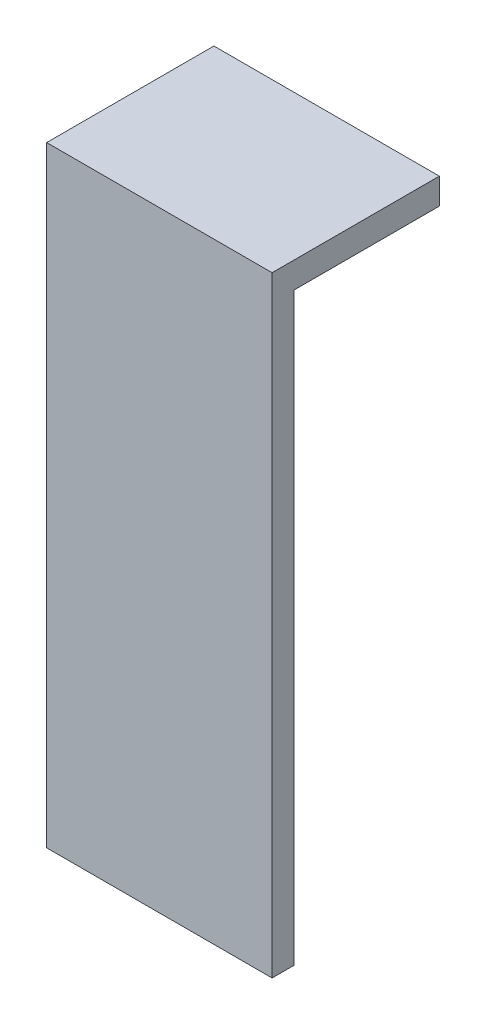
ISO-10303-21;
HEADER;
FILE_DESCRIPTION(('STEP AP214'),'2;1');
FILE_NAME('part.step','',(''),(''),'','','');
FILE_SCHEMA(('AUTOMOTIVE_DESIGN { 1 0 10303 214 1 1 1 1 }'));
ENDSEC;
DATA;
#1=APPLICATION_CONTEXT('core data for automotive mechanical design processes');
#2=APPLICATION_PROTOCOL_DEFINITION('international standard','automotive_design',2000,#1);
#3=PRODUCT_CONTEXT('',#1,'mechanical');
#4=PRODUCT('Part','Part','',(#3));
#5=PRODUCT_RELATED_PRODUCT_CATEGORY('part','',(#4));
#6=PRODUCT_DEFINITION_FORMATION('','',#4);
#7=PRODUCT_DEFINITION_CONTEXT('part definition',#1,'design');
#8=PRODUCT_DEFINITION('design','',#6,#7);
#9=PRODUCT_DEFINITION_SHAPE('','',#8);
#10=(LENGTH_UNIT() NAMED_UNIT(*) SI_UNIT(.MILLI.,.METRE.));
#11=(NAMED_UNIT(*) PLANE_ANGLE_UNIT() SI_UNIT($,.RADIAN.));
#12=(NAMED_UNIT(*) SI_UNIT($,.STERADIAN.) SOLID_ANGLE_UNIT());
#13=UNCERTAINTY_MEASURE_WITH_UNIT(LENGTH_MEASURE(1.E-05),#10,'distance_accuracy_value','');
#14=(GEOMETRIC_REPRESENTATION_CONTEXT(3) GLOBAL_UNCERTAINTY_ASSIGNED_CONTEXT((#13)) GLOBAL_UNIT_ASSIGNED_CONTEXT((#10,
#11,#12)) REPRESENTATION_CONTEXT('',''));
#15=CARTESIAN_POINT('',(0.,0.,0.));
#16=DIRECTION('',(0.,0.,1.));
#17=DIRECTION('',(1.,0.,0.));
#18=AXIS2_PLACEMENT_3D('',#15,#16,#17);
#19=CARTESIAN_POINT('',(-4.2545,21.336,-0.762));
#20=DIRECTION('',(0.,0.,1.));
#21=DIRECTION('',(1.,0.,0.));
#22=AXIS2_PLACEMENT_3D('',#19,#20,#21);
#23=PLANE('',#22);
#24=DIRECTION('',(-1.,0.,0.));
#25=VECTOR('',#24,1.);
#26=CARTESIAN_POINT('',(3.6195,20.42775542234,-0.762000000000005));
#27=LINE('',#26,#25);
#28=CARTESIAN_POINT('',(3.61949999999999,20.42775542234,-0.762000000000005));
#29=VERTEX_POINT('',#28);
#30=CARTESIAN_POINT('',(-4.2545,20.42775542234,-0.762));
#31=VERTEX_POINT('',#30);
#32=EDGE_CURVE('E48',#29,#31,#27,.T.);
#33=ORIENTED_EDGE('',*,*,#32,.F.);
#34=DIRECTION('',(0.,-1.,0.));
#35=VECTOR('',#34,1.);
#36=CARTESIAN_POINT('',(3.61949999999999,21.336,-0.762000000000005));
#37=LINE('',#36,#35);
#38=CARTESIAN_POINT('',(3.61949999999999,0.,-0.762000000000005));
#39=VERTEX_POINT('',#38);
#40=EDGE_CURVE('E84',#29,#39,#37,.T.);
#41=ORIENTED_EDGE('',*,*,#40,.T.);
#42=DIRECTION('',(-1.,0.,0.));
#43=VECTOR('',#42,1.);
#44=CARTESIAN_POINT('',(-4.2545,0.,-0.762));
#45=LINE('',#44,#43);
#46=CARTESIAN_POINT('',(-4.2545,0.,-0.762));
#47=VERTEX_POINT('',#46);
#48=EDGE_CURVE('E88',#39,#47,#45,.T.);
#49=ORIENTED_EDGE('',*,*,#48,.T.);
#50=DIRECTION('',(0.,-1.,0.));
#51=VECTOR('',#50,1.);
#52=CARTESIAN_POINT('',(-4.2545,21.336,-0.762));
#53=LINE('',#52,#51);
#54=EDGE_CURVE('E75',#31,#47,#53,.T.);
#55=ORIENTED_EDGE('',*,*,#54,.F.);
#56=EDGE_LOOP('',(#33,#41,#49,#55));
#57=FACE_BOUND('',#56,.T.);
#58=ADVANCED_FACE('F33',(#57),#23,.F.);
#59=CARTESIAN_POINT('',(-4.2545,21.336,-0.762));
#60=DIRECTION('',(1.,0.,0.));
#61=DIRECTION('',(0.,0.,-1.));
#62=AXIS2_PLACEMENT_3D('',#59,#60,#61);
#63=PLANE('',#62);
#64=DIRECTION('',(0.,0.,1.));
#65=VECTOR('',#64,1.);
#66=CARTESIAN_POINT('',(-4.2545,0.,-0.762));
#67=LINE('',#66,#65);
#68=CARTESIAN_POINT('',(-4.2545,0.,0.));
#69=VERTEX_POINT('',#68);
#70=EDGE_CURVE('E79',#47,#69,#67,.T.);
#71=ORIENTED_EDGE('',*,*,#70,.T.);
#72=DIRECTION('',(0.,-1.,0.));
#73=VECTOR('',#72,1.);
#74=CARTESIAN_POINT('',(-4.2545,21.336,0.));
#75=LINE('',#74,#73);
#76=CARTESIAN_POINT('',(-4.2545,21.336,0.));
#77=VERTEX_POINT('',#76);
#78=EDGE_CURVE('E11',#77,#69,#75,.T.);
#79=ORIENTED_EDGE('',*,*,#78,.F.);
#80=DIRECTION('',(0.,0.,1.));
#81=VECTOR('',#80,1.);
#82=CARTESIAN_POINT('',(-4.2545,21.336,-0.762));
#83=LINE('',#82,#81);
#84=CARTESIAN_POINT('',(-4.25450000000001,21.336,-5.842));
#85=VERTEX_POINT('',#84);
#86=EDGE_CURVE('E92',#85,#77,#83,.T.);
#87=ORIENTED_EDGE('',*,*,#86,.F.);
#88=DIRECTION('',(0.,1.,0.));
#89=VECTOR('',#88,1.);
#90=CARTESIAN_POINT('',(-4.25450000000001,21.336,-5.842));
#91=LINE('',#90,#89);
#92=CARTESIAN_POINT('',(-4.25450000000001,20.42775542234,-5.842));
#93=VERTEX_POINT('',#92);
#94=EDGE_CURVE('E117',#93,#85,#91,.T.);
#95=ORIENTED_EDGE('',*,*,#94,.F.);
#96=DIRECTION('',(0.,0.,1.));
#97=VECTOR('',#96,1.);
#98=CARTESIAN_POINT('',(-4.25450000000001,20.42775542234,-5.842));
#99=LINE('',#98,#97);
#100=EDGE_CURVE('E83',#93,#31,#99,.T.);
#101=ORIENTED_EDGE('',*,*,#100,.T.);
#102=ORIENTED_EDGE('',*,*,#54,.T.);
#103=EDGE_LOOP('',(#71,#79,#87,#95,#101,#102));
#104=FACE_BOUND('',#103,.T.);
#105=ADVANCED_FACE('F35',(#104),#63,.F.);
#106=CARTESIAN_POINT('',(-4.2545,21.336,0.));
#107=DIRECTION('',(0.,0.,-1.));
#108=DIRECTION('',(-1.,0.,0.));
#109=AXIS2_PLACEMENT_3D('',#106,#107,#108);
#110=PLANE('',#109);
#111=DIRECTION('',(1.,0.,0.));
#112=VECTOR('',#111,1.);
#113=CARTESIAN_POINT('',(-4.2545,0.,0.));
#114=LINE('',#113,#112);
#115=CARTESIAN_POINT('',(3.6195,0.,0.));
#116=VERTEX_POINT('',#115);
#117=EDGE_CURVE('E96',#69,#116,#114,.T.);
#118=ORIENTED_EDGE('',*,*,#117,.T.);
#119=DIRECTION('',(0.,-1.,0.));
#120=VECTOR('',#119,1.);
#121=CARTESIAN_POINT('',(3.6195,21.336,0.));
#122=LINE('',#121,#120);
#123=CARTESIAN_POINT('',(3.6195,21.336,0.));
#124=VERTEX_POINT('',#123);
#125=EDGE_CURVE('E41',#124,#116,#122,.T.);
#126=ORIENTED_EDGE('',*,*,#125,.F.);
#127=DIRECTION('',(1.,0.,0.));
#128=VECTOR('',#127,1.);
#129=CARTESIAN_POINT('',(-4.2545,21.336,0.));
#130=LINE('',#129,#128);
#131=EDGE_CURVE('E57',#77,#124,#130,.T.);
#132=ORIENTED_EDGE('',*,*,#131,.F.);
#133=ORIENTED_EDGE('',*,*,#78,.T.);
#134=EDGE_LOOP('',(#118,#126,#132,#133));
#135=FACE_BOUND('',#134,.T.);
#136=ADVANCED_FACE('F112',(#135),#110,.F.);
#137=CARTESIAN_POINT('',(3.61949999999999,21.336,-0.762000000000005));
#138=DIRECTION('',(-1.,0.,0.));
#139=DIRECTION('',(0.,0.,1.));
#140=AXIS2_PLACEMENT_3D('',#137,#138,#139);
#141=PLANE('',#140);
#142=DIRECTION('',(0.,0.,-1.));
#143=VECTOR('',#142,1.);
#144=CARTESIAN_POINT('',(3.61949999999999,0.,-0.762000000000005));
#145=LINE('',#144,#143);
#146=EDGE_CURVE('E93',#116,#39,#145,.T.);
#147=ORIENTED_EDGE('',*,*,#146,.T.);
#148=ORIENTED_EDGE('',*,*,#40,.F.);
#149=DIRECTION('',(0.,0.,1.));
#150=VECTOR('',#149,1.);
#151=CARTESIAN_POINT('',(3.61949999999999,20.42775542234,-5.842));
#152=LINE('',#151,#150);
#153=CARTESIAN_POINT('',(3.61949999999999,20.42775542234,-5.842));
#154=VERTEX_POINT('',#153);
#155=EDGE_CURVE('E97',#154,#29,#152,.T.);
#156=ORIENTED_EDGE('',*,*,#155,.F.);
#157=DIRECTION('',(0.,-1.,0.));
#158=VECTOR('',#157,1.);
#159=CARTESIAN_POINT('',(3.61949999999999,21.336,-5.842));
#160=LINE('',#159,#158);
#161=CARTESIAN_POINT('',(3.61949999999999,21.336,-5.842));
#162=VERTEX_POINT('',#161);
#163=EDGE_CURVE('E135',#162,#154,#160,.T.);
#164=ORIENTED_EDGE('',*,*,#163,.F.);
#165=DIRECTION('',(0.,0.,-1.));
#166=VECTOR('',#165,1.);
#167=CARTESIAN_POINT('',(3.61949999999999,21.336,-0.762000000000005));
#168=LINE('',#167,#166);
#169=EDGE_CURVE('E85',#124,#162,#168,.T.);
#170=ORIENTED_EDGE('',*,*,#169,.F.);
#171=ORIENTED_EDGE('',*,*,#125,.T.);
#172=EDGE_LOOP('',(#147,#148,#156,#164,#170,#171));
#173=FACE_BOUND('',#172,.T.);
#174=ADVANCED_FACE('F109',(#173),#141,.F.);
#175=CARTESIAN_POINT('',(0.,21.336,0.));
#176=DIRECTION('',(0.,1.,0.));
#177=DIRECTION('',(0.,0.,1.));
#178=AXIS2_PLACEMENT_3D('',#175,#176,#177);
#179=PLANE('',#178);
#180=ORIENTED_EDGE('',*,*,#86,.T.);
#181=ORIENTED_EDGE('',*,*,#131,.T.);
#182=ORIENTED_EDGE('',*,*,#169,.T.);
#183=DIRECTION('',(1.,0.,0.));
#184=VECTOR('',#183,1.);
#185=CARTESIAN_POINT('',(3.61949999999999,21.336,-5.842));
#186=LINE('',#185,#184);
#187=EDGE_CURVE('E126',#85,#162,#186,.T.);
#188=ORIENTED_EDGE('',*,*,#187,.F.);
#189=EDGE_LOOP('',(#180,#181,#182,#188));
#190=FACE_BOUND('',#189,.T.);
#191=ADVANCED_FACE('F130',(#190),#179,.T.);
#192=CARTESIAN_POINT('',(0.,0.,0.));
#193=DIRECTION('',(0.,1.,0.));
#194=DIRECTION('',(0.,0.,1.));
#195=AXIS2_PLACEMENT_3D('',#192,#193,#194);
#196=PLANE('',#195);
#197=ORIENTED_EDGE('',*,*,#70,.F.);
#198=ORIENTED_EDGE('',*,*,#48,.F.);
#199=ORIENTED_EDGE('',*,*,#146,.F.);
#200=ORIENTED_EDGE('',*,*,#117,.F.);
#201=EDGE_LOOP('',(#197,#198,#199,#200));
#202=FACE_BOUND('',#201,.T.);
#203=ADVANCED_FACE('F95',(#202),#196,.F.);
#204=CARTESIAN_POINT('',(3.61949999999999,20.42775542234,-5.842));
#205=DIRECTION('',(0.,1.,0.));
#206=DIRECTION('',(0.,0.,1.));
#207=AXIS2_PLACEMENT_3D('',#204,#205,#206);
#208=PLANE('',#207);
#209=ORIENTED_EDGE('',*,*,#32,.T.);
#210=ORIENTED_EDGE('',*,*,#100,.F.);
#211=DIRECTION('',(-1.,0.,0.));
#212=VECTOR('',#211,1.);
#213=CARTESIAN_POINT('',(3.61949999999999,20.42775542234,-5.842));
#214=LINE('',#213,#212);
#215=EDGE_CURVE('E128',#154,#93,#214,.T.);
#216=ORIENTED_EDGE('',*,*,#215,.F.);
#217=ORIENTED_EDGE('',*,*,#155,.T.);
#218=EDGE_LOOP('',(#209,#210,#216,#217));
#219=FACE_BOUND('',#218,.T.);
#220=ADVANCED_FACE('F141',(#219),#208,.F.);
#221=CARTESIAN_POINT('',(0.,0.,-5.842));
#222=DIRECTION('',(0.,0.,-1.));
#223=DIRECTION('',(-1.,0.,0.));
#224=AXIS2_PLACEMENT_3D('',#221,#222,#223);
#225=PLANE('',#224);
#226=ORIENTED_EDGE('',*,*,#163,.T.);
#227=ORIENTED_EDGE('',*,*,#215,.T.);
#228=ORIENTED_EDGE('',*,*,#94,.T.);
#229=ORIENTED_EDGE('',*,*,#187,.T.);
#230=EDGE_LOOP('',(#226,#227,#228,#229));
#231=FACE_BOUND('',#230,.T.);
#232=ADVANCED_FACE('F125',(#231),#225,.T.);
#233=CLOSED_SHELL('',(#58,#105,#136,#174,#191,#203,#220,#232));
#234=MANIFOLD_SOLID_BREP('B2',#233);
#235=ADVANCED_BREP_SHAPE_REPRESENTATION('',(#18,#234),#14);
#236=SHAPE_DEFINITION_REPRESENTATION(#9,#235);
ENDSEC;
END-ISO-10303-21;
